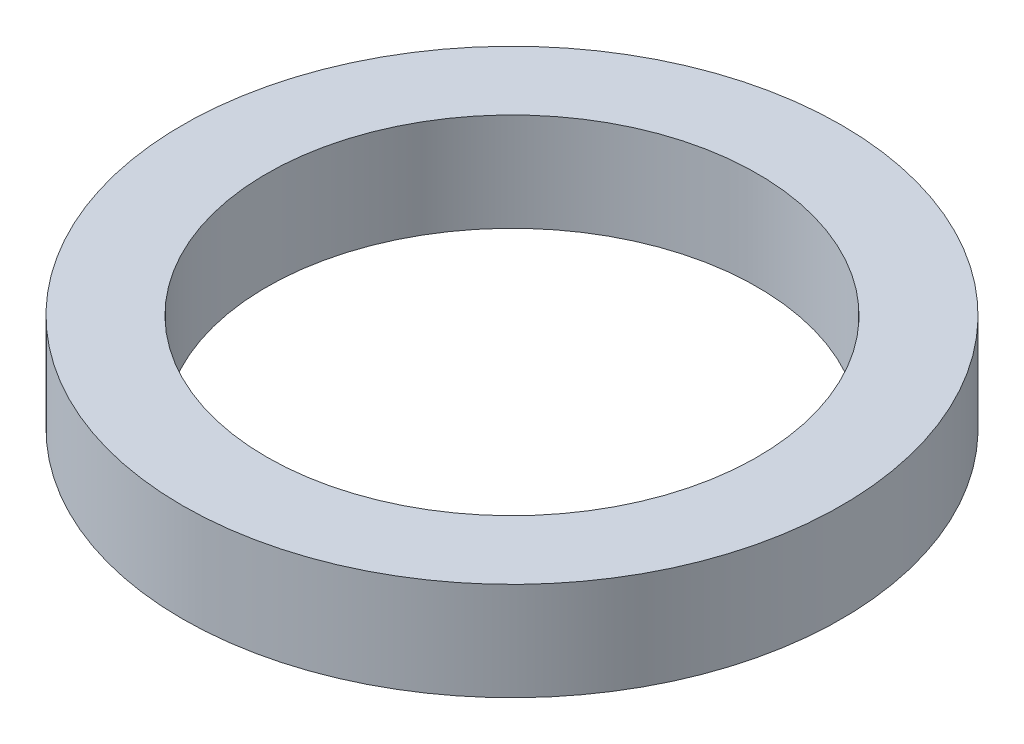
ISO-10303-21;
HEADER;
FILE_DESCRIPTION(('STEP AP214'),'2;1');
FILE_NAME('part.step','',(''),(''),'','','');
FILE_SCHEMA(('AUTOMOTIVE_DESIGN { 1 0 10303 214 1 1 1 1 }'));
ENDSEC;
DATA;
#1=APPLICATION_CONTEXT('core data for automotive mechanical design processes');
#2=APPLICATION_PROTOCOL_DEFINITION('international standard','automotive_design',2000,#1);
#3=PRODUCT_CONTEXT('',#1,'mechanical');
#4=PRODUCT('Part','Part','',(#3));
#5=PRODUCT_RELATED_PRODUCT_CATEGORY('part','',(#4));
#6=PRODUCT_DEFINITION_FORMATION('','',#4);
#7=PRODUCT_DEFINITION_CONTEXT('part definition',#1,'design');
#8=PRODUCT_DEFINITION('design','',#6,#7);
#9=PRODUCT_DEFINITION_SHAPE('','',#8);
#10=(LENGTH_UNIT() NAMED_UNIT(*) SI_UNIT(.MILLI.,.METRE.));
#11=(NAMED_UNIT(*) PLANE_ANGLE_UNIT() SI_UNIT($,.RADIAN.));
#12=(NAMED_UNIT(*) SI_UNIT($,.STERADIAN.) SOLID_ANGLE_UNIT());
#13=UNCERTAINTY_MEASURE_WITH_UNIT(LENGTH_MEASURE(1.E-05),#10,'distance_accuracy_value','');
#14=(GEOMETRIC_REPRESENTATION_CONTEXT(3) GLOBAL_UNCERTAINTY_ASSIGNED_CONTEXT((#13)) GLOBAL_UNIT_ASSIGNED_CONTEXT((#10,
#11,#12)) REPRESENTATION_CONTEXT('',''));
#15=CARTESIAN_POINT('',(0.,0.,0.));
#16=DIRECTION('',(0.,0.,1.));
#17=DIRECTION('',(1.,0.,0.));
#18=AXIS2_PLACEMENT_3D('',#15,#16,#17);
#19=CARTESIAN_POINT('',(0.,3.5,0.));
#20=DIRECTION('',(0.,1.,0.));
#21=DIRECTION('',(0.,0.,1.));
#22=AXIS2_PLACEMENT_3D('',#19,#20,#21);
#23=PLANE('',#22);
#24=CARTESIAN_POINT('',(0.,3.5,0.));
#25=DIRECTION('',(0.,1.,0.));
#26=DIRECTION('',(0.,0.,1.));
#27=AXIS2_PLACEMENT_3D('',#24,#25,#26);
#28=CIRCLE('',#27,23.5);
#29=CARTESIAN_POINT('',(0.,3.5,23.5));
#30=VERTEX_POINT('',#29);
#31=EDGE_CURVE('E10',#30,#30,#28,.T.);
#32=ORIENTED_EDGE('',*,*,#31,.T.);
#33=EDGE_LOOP('',(#32));
#34=FACE_BOUND('',#33,.T.);
#35=CARTESIAN_POINT('',(0.,3.5,0.));
#36=DIRECTION('',(0.,1.,0.));
#37=DIRECTION('',(0.,0.,1.));
#38=AXIS2_PLACEMENT_3D('',#35,#36,#37);
#39=CIRCLE('',#38,17.5);
#40=CARTESIAN_POINT('',(0.,3.5,17.5));
#41=VERTEX_POINT('',#40);
#42=EDGE_CURVE('E60',#41,#41,#39,.T.);
#43=ORIENTED_EDGE('',*,*,#42,.F.);
#44=EDGE_LOOP('',(#43));
#45=FACE_BOUND('',#44,.T.);
#46=ADVANCED_FACE('F47',(#34,#45),#23,.T.);
#47=CARTESIAN_POINT('',(0.,-3.5,0.));
#48=DIRECTION('',(0.,1.,0.));
#49=DIRECTION('',(0.,0.,1.));
#50=AXIS2_PLACEMENT_3D('',#47,#48,#49);
#51=PLANE('',#50);
#52=CARTESIAN_POINT('',(0.,-3.5,0.));
#53=DIRECTION('',(0.,1.,0.));
#54=DIRECTION('',(0.,0.,1.));
#55=AXIS2_PLACEMENT_3D('',#52,#53,#54);
#56=CIRCLE('',#55,23.5);
#57=CARTESIAN_POINT('',(0.,-3.5,23.5));
#58=VERTEX_POINT('',#57);
#59=EDGE_CURVE('E51',#58,#58,#56,.T.);
#60=ORIENTED_EDGE('',*,*,#59,.F.);
#61=EDGE_LOOP('',(#60));
#62=FACE_BOUND('',#61,.T.);
#63=CARTESIAN_POINT('',(0.,-3.5,0.));
#64=DIRECTION('',(0.,1.,0.));
#65=DIRECTION('',(0.,0.,1.));
#66=AXIS2_PLACEMENT_3D('',#63,#64,#65);
#67=CIRCLE('',#66,17.5);
#68=CARTESIAN_POINT('',(0.,-3.5,17.5));
#69=VERTEX_POINT('',#68);
#70=EDGE_CURVE('E62',#69,#69,#67,.T.);
#71=ORIENTED_EDGE('',*,*,#70,.T.);
#72=EDGE_LOOP('',(#71));
#73=FACE_BOUND('',#72,.T.);
#74=ADVANCED_FACE('F74',(#62,#73),#51,.F.);
#75=CARTESIAN_POINT('',(0.,3.5,0.));
#76=DIRECTION('',(0.,-1.,0.));
#77=DIRECTION('',(0.,0.,-1.));
#78=AXIS2_PLACEMENT_3D('',#75,#76,#77);
#79=CYLINDRICAL_SURFACE('',#78,23.5);
#80=ORIENTED_EDGE('',*,*,#31,.F.);
#81=EDGE_LOOP('',(#80));
#82=FACE_BOUND('',#81,.T.);
#83=ORIENTED_EDGE('',*,*,#59,.T.);
#84=EDGE_LOOP('',(#83));
#85=FACE_BOUND('',#84,.T.);
#86=ADVANCED_FACE('F49',(#82,#85),#79,.T.);
#87=CARTESIAN_POINT('',(0.,3.5,0.));
#88=DIRECTION('',(0.,-1.,0.));
#89=DIRECTION('',(0.,0.,-1.));
#90=AXIS2_PLACEMENT_3D('',#87,#88,#89);
#91=CYLINDRICAL_SURFACE('',#90,17.5);
#92=ORIENTED_EDGE('',*,*,#42,.T.);
#93=EDGE_LOOP('',(#92));
#94=FACE_BOUND('',#93,.T.);
#95=ORIENTED_EDGE('',*,*,#70,.F.);
#96=EDGE_LOOP('',(#95));
#97=FACE_BOUND('',#96,.T.);
#98=ADVANCED_FACE('F70',(#94,#97),#91,.F.);
#99=CLOSED_SHELL('',(#46,#74,#86,#98));
#100=MANIFOLD_SOLID_BREP('B2',#99);
#101=ADVANCED_BREP_SHAPE_REPRESENTATION('',(#18,#100),#14);
#102=SHAPE_DEFINITION_REPRESENTATION(#9,#101);
ENDSEC;
END-ISO-10303-21;
